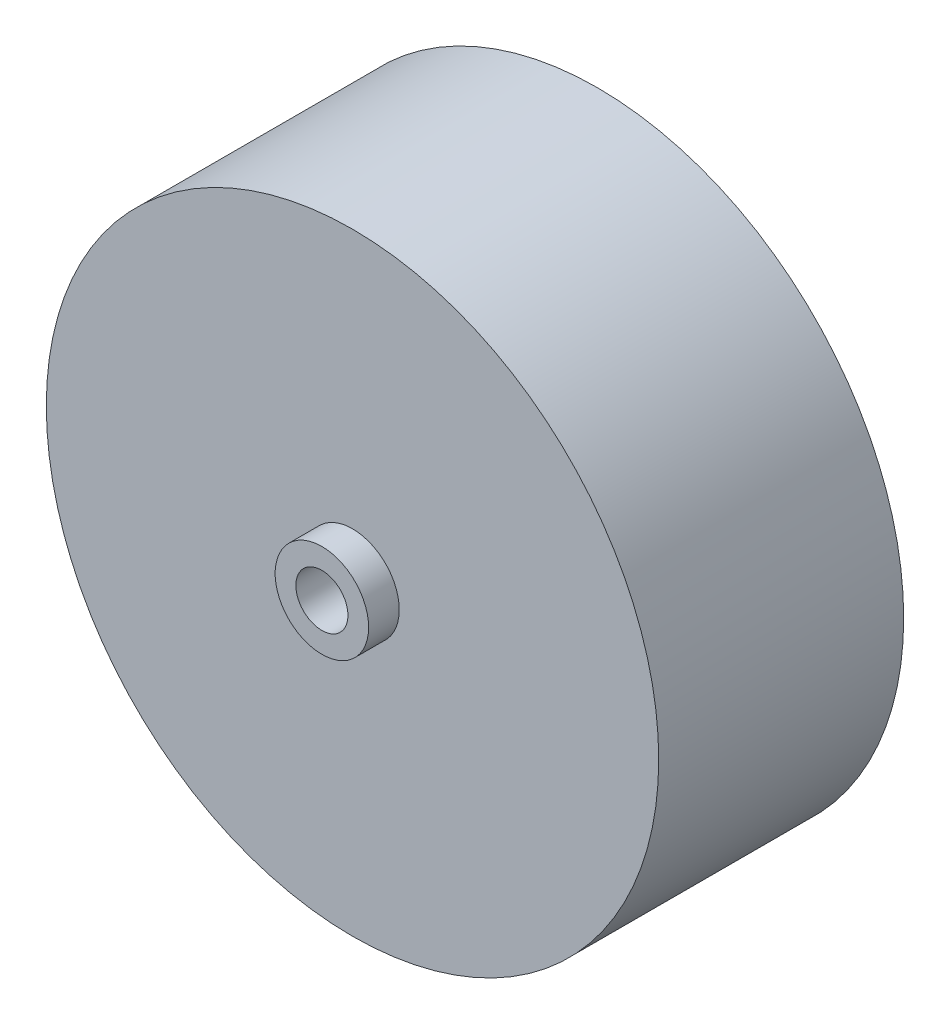
ISO-10303-21;
HEADER;
FILE_DESCRIPTION(('STEP AP214'),'2;1');
FILE_NAME('part.step','',(''),(''),'','','');
FILE_SCHEMA(('AUTOMOTIVE_DESIGN { 1 0 10303 214 1 1 1 1 }'));
ENDSEC;
DATA;
#1=APPLICATION_CONTEXT('core data for automotive mechanical design processes');
#2=APPLICATION_PROTOCOL_DEFINITION('international standard','automotive_design',2000,#1);
#3=PRODUCT_CONTEXT('',#1,'mechanical');
#4=PRODUCT('Part','Part','',(#3));
#5=PRODUCT_RELATED_PRODUCT_CATEGORY('part','',(#4));
#6=PRODUCT_DEFINITION_FORMATION('','',#4);
#7=PRODUCT_DEFINITION_CONTEXT('part definition',#1,'design');
#8=PRODUCT_DEFINITION('design','',#6,#7);
#9=PRODUCT_DEFINITION_SHAPE('','',#8);
#10=(LENGTH_UNIT() NAMED_UNIT(*) SI_UNIT(.MILLI.,.METRE.));
#11=(NAMED_UNIT(*) PLANE_ANGLE_UNIT() SI_UNIT($,.RADIAN.));
#12=(NAMED_UNIT(*) SI_UNIT($,.STERADIAN.) SOLID_ANGLE_UNIT());
#13=UNCERTAINTY_MEASURE_WITH_UNIT(LENGTH_MEASURE(1.E-05),#10,'distance_accuracy_value','');
#14=(GEOMETRIC_REPRESENTATION_CONTEXT(3) GLOBAL_UNCERTAINTY_ASSIGNED_CONTEXT((#13)) GLOBAL_UNIT_ASSIGNED_CONTEXT((#10,
#11,#12)) REPRESENTATION_CONTEXT('',''));
#15=CARTESIAN_POINT('',(0.,0.,0.));
#16=DIRECTION('',(0.,0.,1.));
#17=DIRECTION('',(1.,0.,0.));
#18=AXIS2_PLACEMENT_3D('',#15,#16,#17);
#19=CARTESIAN_POINT('',(0.,0.,25.4));
#20=DIRECTION('',(0.,0.,-1.));
#21=DIRECTION('',(-1.,0.,0.));
#22=AXIS2_PLACEMENT_3D('',#19,#20,#21);
#23=CYLINDRICAL_SURFACE('',#22,31.75);
#24=CARTESIAN_POINT('',(0.,0.,25.4));
#25=DIRECTION('',(0.,0.,1.));
#26=DIRECTION('',(1.,0.,0.));
#27=AXIS2_PLACEMENT_3D('',#24,#25,#26);
#28=CIRCLE('',#27,31.75);
#29=CARTESIAN_POINT('',(31.75,0.,25.4));
#30=VERTEX_POINT('',#29);
#31=EDGE_CURVE('E57',#30,#30,#28,.T.);
#32=ORIENTED_EDGE('',*,*,#31,.F.);
#33=EDGE_LOOP('',(#32));
#34=FACE_BOUND('',#33,.T.);
#35=CARTESIAN_POINT('',(0.,0.,0.));
#36=DIRECTION('',(0.,0.,1.));
#37=DIRECTION('',(1.,0.,0.));
#38=AXIS2_PLACEMENT_3D('',#35,#36,#37);
#39=CIRCLE('',#38,31.75);
#40=CARTESIAN_POINT('',(31.75,0.,0.));
#41=VERTEX_POINT('',#40);
#42=EDGE_CURVE('E52',#41,#41,#39,.T.);
#43=ORIENTED_EDGE('',*,*,#42,.T.);
#44=EDGE_LOOP('',(#43));
#45=FACE_BOUND('',#44,.T.);
#46=ADVANCED_FACE('F49',(#34,#45),#23,.T.);
#47=CARTESIAN_POINT('',(0.,0.,25.4));
#48=DIRECTION('',(0.,0.,1.));
#49=DIRECTION('',(1.,0.,0.));
#50=AXIS2_PLACEMENT_3D('',#47,#48,#49);
#51=PLANE('',#50);
#52=CARTESIAN_POINT('',(0.,0.,25.4));
#53=DIRECTION('',(0.,0.,1.));
#54=DIRECTION('',(1.,0.,0.));
#55=AXIS2_PLACEMENT_3D('',#52,#53,#54);
#56=CIRCLE('',#55,4.84559806639549);
#57=CARTESIAN_POINT('',(4.84559806639549,0.,25.4));
#58=VERTEX_POINT('',#57);
#59=EDGE_CURVE('E10',#58,#58,#56,.T.);
#60=ORIENTED_EDGE('',*,*,#59,.F.);
#61=EDGE_LOOP('',(#60));
#62=FACE_BOUND('',#61,.T.);
#63=ORIENTED_EDGE('',*,*,#31,.T.);
#64=EDGE_LOOP('',(#63));
#65=FACE_BOUND('',#64,.T.);
#66=ADVANCED_FACE('F83',(#62,#65),#51,.T.);
#67=CARTESIAN_POINT('',(0.,0.,0.));
#68=DIRECTION('',(0.,0.,1.));
#69=DIRECTION('',(1.,0.,0.));
#70=AXIS2_PLACEMENT_3D('',#67,#68,#69);
#71=PLANE('',#70);
#72=CARTESIAN_POINT('',(0.,0.,0.));
#73=DIRECTION('',(0.,0.,1.));
#74=DIRECTION('',(1.,0.,0.));
#75=AXIS2_PLACEMENT_3D('',#72,#73,#74);
#76=CIRCLE('',#75,2.7);
#77=CARTESIAN_POINT('',(2.7,0.,0.));
#78=VERTEX_POINT('',#77);
#79=EDGE_CURVE('E72',#78,#78,#76,.F.);
#80=ORIENTED_EDGE('',*,*,#79,.F.);
#81=EDGE_LOOP('',(#80));
#82=FACE_BOUND('',#81,.T.);
#83=ORIENTED_EDGE('',*,*,#42,.F.);
#84=EDGE_LOOP('',(#83));
#85=FACE_BOUND('',#84,.T.);
#86=ADVANCED_FACE('F79',(#82,#85),#71,.F.);
#87=CARTESIAN_POINT('',(0.,0.,28.575));
#88=DIRECTION('',(0.,0.,1.));
#89=DIRECTION('',(1.,0.,0.));
#90=AXIS2_PLACEMENT_3D('',#87,#88,#89);
#91=PLANE('',#90);
#92=CARTESIAN_POINT('',(0.,0.,28.575));
#93=DIRECTION('',(0.,0.,1.));
#94=DIRECTION('',(1.,0.,0.));
#95=AXIS2_PLACEMENT_3D('',#92,#93,#94);
#96=CIRCLE('',#95,4.84559806639549);
#97=CARTESIAN_POINT('',(4.84559806639549,0.,28.575));
#98=VERTEX_POINT('',#97);
#99=EDGE_CURVE('E64',#98,#98,#96,.T.);
#100=ORIENTED_EDGE('',*,*,#99,.T.);
#101=EDGE_LOOP('',(#100));
#102=FACE_BOUND('',#101,.T.);
#103=CARTESIAN_POINT('',(0.,0.,28.575));
#104=DIRECTION('',(0.,0.,1.));
#105=DIRECTION('',(1.,0.,0.));
#106=AXIS2_PLACEMENT_3D('',#103,#104,#105);
#107=CIRCLE('',#106,2.7);
#108=CARTESIAN_POINT('',(2.7,0.,28.575));
#109=VERTEX_POINT('',#108);
#110=EDGE_CURVE('E68',#109,#109,#107,.T.);
#111=ORIENTED_EDGE('',*,*,#110,.F.);
#112=EDGE_LOOP('',(#111));
#113=FACE_BOUND('',#112,.T.);
#114=ADVANCED_FACE('F82',(#102,#113),#91,.T.);
#115=CARTESIAN_POINT('',(0.,0.,28.575));
#116=DIRECTION('',(0.,0.,-1.));
#117=DIRECTION('',(-1.,0.,0.));
#118=AXIS2_PLACEMENT_3D('',#115,#116,#117);
#119=CYLINDRICAL_SURFACE('',#118,4.84559806639549);
#120=ORIENTED_EDGE('',*,*,#99,.F.);
#121=EDGE_LOOP('',(#120));
#122=FACE_BOUND('',#121,.T.);
#123=ORIENTED_EDGE('',*,*,#59,.T.);
#124=EDGE_LOOP('',(#123));
#125=FACE_BOUND('',#124,.T.);
#126=ADVANCED_FACE('F102',(#122,#125),#119,.T.);
#127=CARTESIAN_POINT('',(0.,0.,28.575));
#128=DIRECTION('',(0.,0.,-1.));
#129=DIRECTION('',(-1.,0.,0.));
#130=AXIS2_PLACEMENT_3D('',#127,#128,#129);
#131=CYLINDRICAL_SURFACE('',#130,2.7);
#132=ORIENTED_EDGE('',*,*,#110,.T.);
#133=EDGE_LOOP('',(#132));
#134=FACE_BOUND('',#133,.T.);
#135=ORIENTED_EDGE('',*,*,#79,.T.);
#136=EDGE_LOOP('',(#135));
#137=FACE_BOUND('',#136,.T.);
#138=ADVANCED_FACE('F77',(#134,#137),#131,.F.);
#139=CLOSED_SHELL('',(#46,#66,#86,#114,#126,#138));
#140=MANIFOLD_SOLID_BREP('B2',#139);
#141=ADVANCED_BREP_SHAPE_REPRESENTATION('',(#18,#140),#14);
#142=SHAPE_DEFINITION_REPRESENTATION(#9,#141);
ENDSEC;
END-ISO-10303-21;
